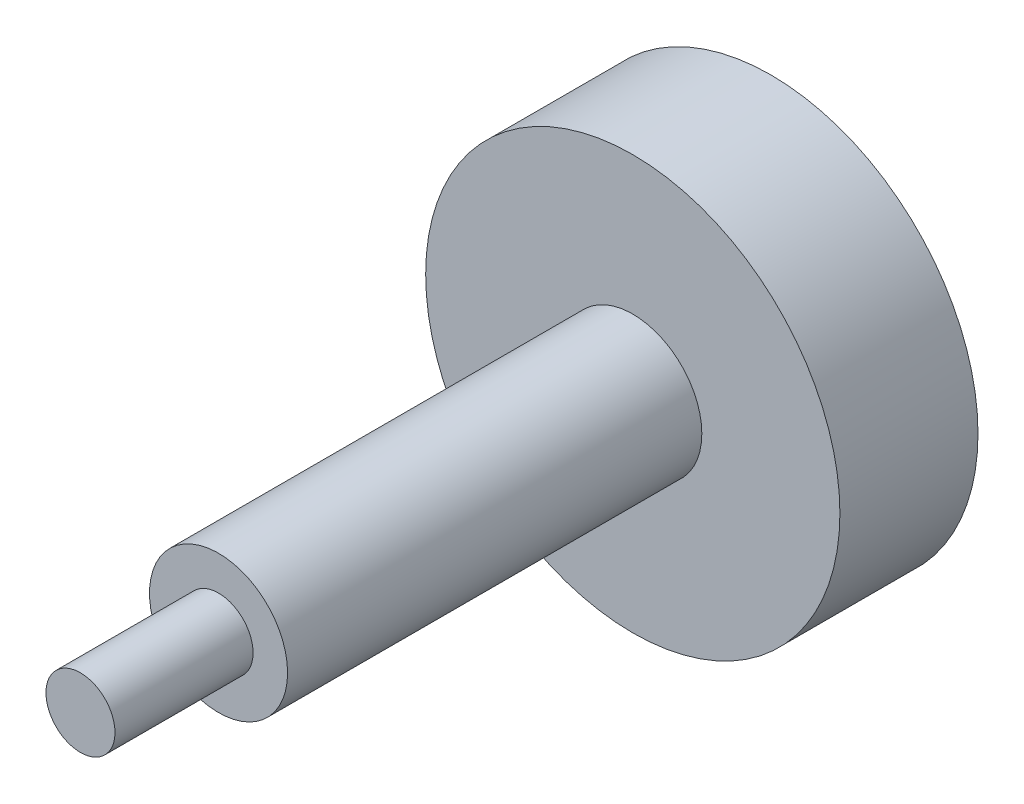
ISO-10303-21;
HEADER;
FILE_DESCRIPTION(('STEP AP214'),'2;1');
FILE_NAME('part.step','',(''),(''),'','','');
FILE_SCHEMA(('AUTOMOTIVE_DESIGN { 1 0 10303 214 1 1 1 1 }'));
ENDSEC;
DATA;
#1=APPLICATION_CONTEXT('core data for automotive mechanical design processes');
#2=APPLICATION_PROTOCOL_DEFINITION('international standard','automotive_design',2000,#1);
#3=PRODUCT_CONTEXT('',#1,'mechanical');
#4=PRODUCT('Part','Part','',(#3));
#5=PRODUCT_RELATED_PRODUCT_CATEGORY('part','',(#4));
#6=PRODUCT_DEFINITION_FORMATION('','',#4);
#7=PRODUCT_DEFINITION_CONTEXT('part definition',#1,'design');
#8=PRODUCT_DEFINITION('design','',#6,#7);
#9=PRODUCT_DEFINITION_SHAPE('','',#8);
#10=(LENGTH_UNIT() NAMED_UNIT(*) SI_UNIT(.MILLI.,.METRE.));
#11=(NAMED_UNIT(*) PLANE_ANGLE_UNIT() SI_UNIT($,.RADIAN.));
#12=(NAMED_UNIT(*) SI_UNIT($,.STERADIAN.) SOLID_ANGLE_UNIT());
#13=UNCERTAINTY_MEASURE_WITH_UNIT(LENGTH_MEASURE(1.E-05),#10,'distance_accuracy_value','');
#14=(GEOMETRIC_REPRESENTATION_CONTEXT(3) GLOBAL_UNCERTAINTY_ASSIGNED_CONTEXT((#13)) GLOBAL_UNIT_ASSIGNED_CONTEXT((#10,
#11,#12)) REPRESENTATION_CONTEXT('',''));
#15=CARTESIAN_POINT('',(0.,0.,0.));
#16=DIRECTION('',(0.,0.,1.));
#17=DIRECTION('',(1.,0.,0.));
#18=AXIS2_PLACEMENT_3D('',#15,#16,#17);
#19=CARTESIAN_POINT('',(0.,0.,200.));
#20=DIRECTION('',(0.,0.,-1.));
#21=DIRECTION('',(-1.,0.,0.));
#22=AXIS2_PLACEMENT_3D('',#19,#20,#21);
#23=CYLINDRICAL_SURFACE('',#22,300.);
#24=CARTESIAN_POINT('',(0.,0.,200.));
#25=DIRECTION('',(0.,0.,1.));
#26=DIRECTION('',(1.,0.,0.));
#27=AXIS2_PLACEMENT_3D('',#24,#25,#26);
#28=CIRCLE('',#27,300.);
#29=CARTESIAN_POINT('',(300.,0.,200.));
#30=VERTEX_POINT('',#29);
#31=EDGE_CURVE('E43',#30,#30,#28,.T.);
#32=ORIENTED_EDGE('',*,*,#31,.F.);
#33=EDGE_LOOP('',(#32));
#34=FACE_BOUND('',#33,.T.);
#35=CARTESIAN_POINT('',(0.,0.,0.));
#36=DIRECTION('',(0.,0.,1.));
#37=DIRECTION('',(1.,0.,0.));
#38=AXIS2_PLACEMENT_3D('',#35,#36,#37);
#39=CIRCLE('',#38,300.);
#40=CARTESIAN_POINT('',(300.,0.,0.));
#41=VERTEX_POINT('',#40);
#42=EDGE_CURVE('E34',#41,#41,#39,.T.);
#43=ORIENTED_EDGE('',*,*,#42,.T.);
#44=EDGE_LOOP('',(#43));
#45=FACE_BOUND('',#44,.T.);
#46=ADVANCED_FACE('F31',(#34,#45),#23,.T.);
#47=CARTESIAN_POINT('',(0.,0.,200.));
#48=DIRECTION('',(0.,0.,1.));
#49=DIRECTION('',(1.,0.,0.));
#50=AXIS2_PLACEMENT_3D('',#47,#48,#49);
#51=PLANE('',#50);
#52=CARTESIAN_POINT('',(0.,0.,200.));
#53=DIRECTION('',(0.,0.,1.));
#54=DIRECTION('',(1.,0.,0.));
#55=AXIS2_PLACEMENT_3D('',#52,#53,#54);
#56=CIRCLE('',#55,100.);
#57=CARTESIAN_POINT('',(100.,0.,200.));
#58=VERTEX_POINT('',#57);
#59=EDGE_CURVE('E38',#58,#58,#56,.T.);
#60=ORIENTED_EDGE('',*,*,#59,.F.);
#61=EDGE_LOOP('',(#60));
#62=FACE_BOUND('',#61,.T.);
#63=ORIENTED_EDGE('',*,*,#31,.T.);
#64=EDGE_LOOP('',(#63));
#65=FACE_BOUND('',#64,.T.);
#66=ADVANCED_FACE('F60',(#62,#65),#51,.T.);
#67=CARTESIAN_POINT('',(0.,0.,0.));
#68=DIRECTION('',(0.,0.,1.));
#69=DIRECTION('',(1.,0.,0.));
#70=AXIS2_PLACEMENT_3D('',#67,#68,#69);
#71=PLANE('',#70);
#72=ORIENTED_EDGE('',*,*,#42,.F.);
#73=EDGE_LOOP('',(#72));
#74=FACE_BOUND('',#73,.T.);
#75=ADVANCED_FACE('F57',(#74),#71,.F.);
#76=CARTESIAN_POINT('',(0.,0.,800.));
#77=DIRECTION('',(0.,0.,-1.));
#78=DIRECTION('',(-1.,0.,0.));
#79=AXIS2_PLACEMENT_3D('',#76,#77,#78);
#80=CYLINDRICAL_SURFACE('',#79,100.);
#81=CARTESIAN_POINT('',(0.,0.,800.));
#82=DIRECTION('',(0.,0.,1.));
#83=DIRECTION('',(1.,0.,0.));
#84=AXIS2_PLACEMENT_3D('',#81,#82,#83);
#85=CIRCLE('',#84,100.);
#86=CARTESIAN_POINT('',(100.,0.,800.));
#87=VERTEX_POINT('',#86);
#88=EDGE_CURVE('E48',#87,#87,#85,.T.);
#89=ORIENTED_EDGE('',*,*,#88,.F.);
#90=EDGE_LOOP('',(#89));
#91=FACE_BOUND('',#90,.T.);
#92=ORIENTED_EDGE('',*,*,#59,.T.);
#93=EDGE_LOOP('',(#92));
#94=FACE_BOUND('',#93,.T.);
#95=ADVANCED_FACE('F59',(#91,#94),#80,.T.);
#96=CARTESIAN_POINT('',(0.,0.,800.));
#97=DIRECTION('',(0.,0.,1.));
#98=DIRECTION('',(1.,0.,0.));
#99=AXIS2_PLACEMENT_3D('',#96,#97,#98);
#100=PLANE('',#99);
#101=CARTESIAN_POINT('',(0.,0.,800.));
#102=DIRECTION('',(0.,0.,1.));
#103=DIRECTION('',(1.,0.,0.));
#104=AXIS2_PLACEMENT_3D('',#101,#102,#103);
#105=CIRCLE('',#104,50.);
#106=CARTESIAN_POINT('',(50.,0.,800.));
#107=VERTEX_POINT('',#106);
#108=EDGE_CURVE('E10',#107,#107,#105,.T.);
#109=ORIENTED_EDGE('',*,*,#108,.F.);
#110=EDGE_LOOP('',(#109));
#111=FACE_BOUND('',#110,.T.);
#112=ORIENTED_EDGE('',*,*,#88,.T.);
#113=EDGE_LOOP('',(#112));
#114=FACE_BOUND('',#113,.T.);
#115=ADVANCED_FACE('F65',(#111,#114),#100,.T.);
#116=CARTESIAN_POINT('',(0.,0.,1000.));
#117=DIRECTION('',(0.,0.,-1.));
#118=DIRECTION('',(-1.,0.,0.));
#119=AXIS2_PLACEMENT_3D('',#116,#117,#118);
#120=CYLINDRICAL_SURFACE('',#119,50.);
#121=CARTESIAN_POINT('',(0.,0.,1000.));
#122=DIRECTION('',(0.,0.,1.));
#123=DIRECTION('',(1.,0.,0.));
#124=AXIS2_PLACEMENT_3D('',#121,#122,#123);
#125=CIRCLE('',#124,50.);
#126=CARTESIAN_POINT('',(50.,0.,1000.));
#127=VERTEX_POINT('',#126);
#128=EDGE_CURVE('E47',#127,#127,#125,.T.);
#129=ORIENTED_EDGE('',*,*,#128,.F.);
#130=EDGE_LOOP('',(#129));
#131=FACE_BOUND('',#130,.T.);
#132=ORIENTED_EDGE('',*,*,#108,.T.);
#133=EDGE_LOOP('',(#132));
#134=FACE_BOUND('',#133,.T.);
#135=ADVANCED_FACE('F95',(#131,#134),#120,.T.);
#136=CARTESIAN_POINT('',(0.,0.,1000.));
#137=DIRECTION('',(0.,0.,1.));
#138=DIRECTION('',(1.,0.,0.));
#139=AXIS2_PLACEMENT_3D('',#136,#137,#138);
#140=PLANE('',#139);
#141=ORIENTED_EDGE('',*,*,#128,.T.);
#142=EDGE_LOOP('',(#141));
#143=FACE_BOUND('',#142,.T.);
#144=ADVANCED_FACE('F105',(#143),#140,.T.);
#145=CLOSED_SHELL('',(#46,#66,#75,#95,#115,#135,#144));
#146=MANIFOLD_SOLID_BREP('B2',#145);
#147=ADVANCED_BREP_SHAPE_REPRESENTATION('',(#18,#146),#14);
#148=SHAPE_DEFINITION_REPRESENTATION(#9,#147);
ENDSEC;
END-ISO-10303-21;
